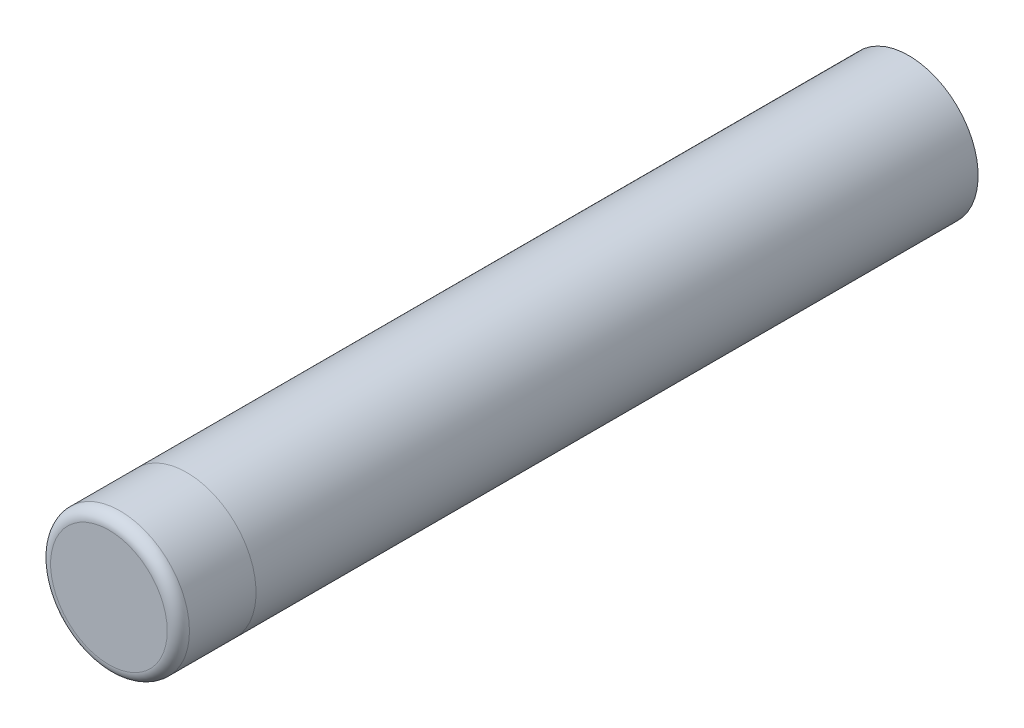
ISO-10303-21;
HEADER;
FILE_DESCRIPTION(('STEP AP214'),'2;1');
FILE_NAME('part.step','',(''),(''),'','','');
FILE_SCHEMA(('AUTOMOTIVE_DESIGN { 1 0 10303 214 1 1 1 1 }'));
ENDSEC;
DATA;
#1=APPLICATION_CONTEXT('core data for automotive mechanical design processes');
#2=APPLICATION_PROTOCOL_DEFINITION('international standard','automotive_design',2000,#1);
#3=PRODUCT_CONTEXT('',#1,'mechanical');
#4=PRODUCT('Part','Part','',(#3));
#5=PRODUCT_RELATED_PRODUCT_CATEGORY('part','',(#4));
#6=PRODUCT_DEFINITION_FORMATION('','',#4);
#7=PRODUCT_DEFINITION_CONTEXT('part definition',#1,'design');
#8=PRODUCT_DEFINITION('design','',#6,#7);
#9=PRODUCT_DEFINITION_SHAPE('','',#8);
#10=(LENGTH_UNIT() NAMED_UNIT(*) SI_UNIT(.MILLI.,.METRE.));
#11=(NAMED_UNIT(*) PLANE_ANGLE_UNIT() SI_UNIT($,.RADIAN.));
#12=(NAMED_UNIT(*) SI_UNIT($,.STERADIAN.) SOLID_ANGLE_UNIT());
#13=UNCERTAINTY_MEASURE_WITH_UNIT(LENGTH_MEASURE(1.E-05),#10,'distance_accuracy_value','');
#14=(GEOMETRIC_REPRESENTATION_CONTEXT(3) GLOBAL_UNCERTAINTY_ASSIGNED_CONTEXT((#13)) GLOBAL_UNIT_ASSIGNED_CONTEXT((#10,
#11,#12)) REPRESENTATION_CONTEXT('',''));
#15=CARTESIAN_POINT('',(0.,0.,0.));
#16=DIRECTION('',(0.,0.,1.));
#17=DIRECTION('',(1.,0.,0.));
#18=AXIS2_PLACEMENT_3D('',#15,#16,#17);
#19=CARTESIAN_POINT('',(0.,0.,7.));
#20=DIRECTION('',(0.,0.,-1.));
#21=DIRECTION('',(-1.,0.,0.));
#22=AXIS2_PLACEMENT_3D('',#19,#20,#21);
#23=CYLINDRICAL_SURFACE('',#22,6.25);
#24=CARTESIAN_POINT('',(0.,0.,6.));
#25=DIRECTION('',(0.,0.,1.));
#26=DIRECTION('',(1.,0.,0.));
#27=AXIS2_PLACEMENT_3D('',#24,#25,#26);
#28=CIRCLE('',#27,6.25);
#29=CARTESIAN_POINT('',(6.25,0.,6.));
#30=VERTEX_POINT('',#29);
#31=EDGE_CURVE('E10',#30,#30,#28,.F.);
#32=ORIENTED_EDGE('',*,*,#31,.T.);
#33=EDGE_LOOP('',(#32));
#34=FACE_BOUND('',#33,.T.);
#35=CARTESIAN_POINT('',(0.,0.,0.));
#36=DIRECTION('',(0.,0.,-1.));
#37=DIRECTION('',(-1.,0.,0.));
#38=AXIS2_PLACEMENT_3D('',#35,#36,#37);
#39=CIRCLE('',#38,6.245);
#40=CARTESIAN_POINT('',(-6.245,0.,0.));
#41=VERTEX_POINT('',#40);
#42=EDGE_CURVE('E57',#41,#41,#39,.T.);
#43=ORIENTED_EDGE('',*,*,#42,.F.);
#44=EDGE_LOOP('',(#43));
#45=FACE_BOUND('',#44,.T.);
#46=ADVANCED_FACE('F39',(#34,#45),#23,.T.);
#47=CARTESIAN_POINT('',(0.,0.,7.));
#48=DIRECTION('',(0.,0.,1.));
#49=DIRECTION('',(1.,0.,0.));
#50=AXIS2_PLACEMENT_3D('',#47,#48,#49);
#51=PLANE('',#50);
#52=CARTESIAN_POINT('',(0.,0.,7.));
#53=DIRECTION('',(0.,0.,1.));
#54=DIRECTION('',(1.,0.,0.));
#55=AXIS2_PLACEMENT_3D('',#52,#53,#54);
#56=CIRCLE('',#55,5.25);
#57=CARTESIAN_POINT('',(5.25,0.,7.));
#58=VERTEX_POINT('',#57);
#59=EDGE_CURVE('E47',#58,#58,#56,.T.);
#60=ORIENTED_EDGE('',*,*,#59,.T.);
#61=EDGE_LOOP('',(#60));
#62=FACE_BOUND('',#61,.T.);
#63=ADVANCED_FACE('F73',(#62),#51,.T.);
#64=CARTESIAN_POINT('',(0.,0.,-65.));
#65=DIRECTION('',(0.,0.,-1.));
#66=DIRECTION('',(-1.,0.,0.));
#67=AXIS2_PLACEMENT_3D('',#64,#65,#66);
#68=PLANE('',#67);
#69=CARTESIAN_POINT('',(0.,0.,-65.));
#70=DIRECTION('',(0.,0.,-1.));
#71=DIRECTION('',(-1.,0.,0.));
#72=AXIS2_PLACEMENT_3D('',#69,#70,#71);
#73=CIRCLE('',#72,6.245);
#74=CARTESIAN_POINT('',(-6.245,0.,-65.));
#75=VERTEX_POINT('',#74);
#76=EDGE_CURVE('E52',#75,#75,#73,.T.);
#77=ORIENTED_EDGE('',*,*,#76,.T.);
#78=EDGE_LOOP('',(#77));
#79=FACE_BOUND('',#78,.T.);
#80=CARTESIAN_POINT('',(0.,0.,-65.));
#81=DIRECTION('',(0.,0.,-1.));
#82=DIRECTION('',(-1.,0.,0.));
#83=AXIS2_PLACEMENT_3D('',#80,#81,#82);
#84=CIRCLE('',#83,3.);
#85=CARTESIAN_POINT('',(-3.,0.,-65.));
#86=VERTEX_POINT('',#85);
#87=EDGE_CURVE('E103',#86,#86,#84,.T.);
#88=ORIENTED_EDGE('',*,*,#87,.F.);
#89=EDGE_LOOP('',(#88));
#90=FACE_BOUND('',#89,.T.);
#91=ADVANCED_FACE('F81',(#79,#90),#68,.T.);
#92=CARTESIAN_POINT('',(0.,0.,-65.));
#93=DIRECTION('',(0.,0.,1.));
#94=DIRECTION('',(1.,0.,0.));
#95=AXIS2_PLACEMENT_3D('',#92,#93,#94);
#96=CYLINDRICAL_SURFACE('',#95,6.245);
#97=ORIENTED_EDGE('',*,*,#76,.F.);
#98=EDGE_LOOP('',(#97));
#99=FACE_BOUND('',#98,.T.);
#100=ORIENTED_EDGE('',*,*,#42,.T.);
#101=EDGE_LOOP('',(#100));
#102=FACE_BOUND('',#101,.T.);
#103=ADVANCED_FACE('F82',(#99,#102),#96,.T.);
#104=CARTESIAN_POINT('',(0.,0.,-65.));
#105=DIRECTION('',(0.,0.,1.));
#106=DIRECTION('',(1.,0.,0.));
#107=AXIS2_PLACEMENT_3D('',#104,#105,#106);
#108=CYLINDRICAL_SURFACE('',#107,3.);
#109=ORIENTED_EDGE('',*,*,#87,.T.);
#110=EDGE_LOOP('',(#109));
#111=FACE_BOUND('',#110,.T.);
#112=CARTESIAN_POINT('',(0.,0.,0.));
#113=DIRECTION('',(0.,0.,-1.));
#114=DIRECTION('',(-1.,0.,0.));
#115=AXIS2_PLACEMENT_3D('',#112,#113,#114);
#116=CIRCLE('',#115,3.);
#117=CARTESIAN_POINT('',(-3.,0.,0.));
#118=VERTEX_POINT('',#117);
#119=EDGE_CURVE('E99',#118,#118,#116,.T.);
#120=ORIENTED_EDGE('',*,*,#119,.F.);
#121=EDGE_LOOP('',(#120));
#122=FACE_BOUND('',#121,.T.);
#123=ADVANCED_FACE('F77',(#111,#122),#108,.F.);
#124=CARTESIAN_POINT('',(0.,0.,0.));
#125=DIRECTION('',(0.,0.,1.));
#126=DIRECTION('',(1.,0.,0.));
#127=AXIS2_PLACEMENT_3D('',#124,#125,#126);
#128=PLANE('',#127);
#129=ORIENTED_EDGE('',*,*,#119,.T.);
#130=EDGE_LOOP('',(#129));
#131=FACE_BOUND('',#130,.T.);
#132=ADVANCED_FACE('F74',(#131),#128,.F.);
#133=CARTESIAN_POINT('',(0.,0.,6.));
#134=DIRECTION('',(0.,0.,1.));
#135=DIRECTION('',(1.,0.,0.));
#136=AXIS2_PLACEMENT_3D('',#133,#134,#135);
#137=TOROIDAL_SURFACE('',#136,5.25,1.);
#138=ORIENTED_EDGE('',*,*,#31,.F.);
#139=EDGE_LOOP('',(#138));
#140=FACE_BOUND('',#139,.T.);
#141=ORIENTED_EDGE('',*,*,#59,.F.);
#142=EDGE_LOOP('',(#141));
#143=FACE_BOUND('',#142,.T.);
#144=ADVANCED_FACE('F41',(#140,#143),#137,.T.);
#145=CLOSED_SHELL('',(#46,#63,#91,#103,#123,#132,#144));
#146=MANIFOLD_SOLID_BREP('B2',#145);
#147=ADVANCED_BREP_SHAPE_REPRESENTATION('',(#18,#146),#14);
#148=SHAPE_DEFINITION_REPRESENTATION(#9,#147);
ENDSEC;
END-ISO-10303-21;
